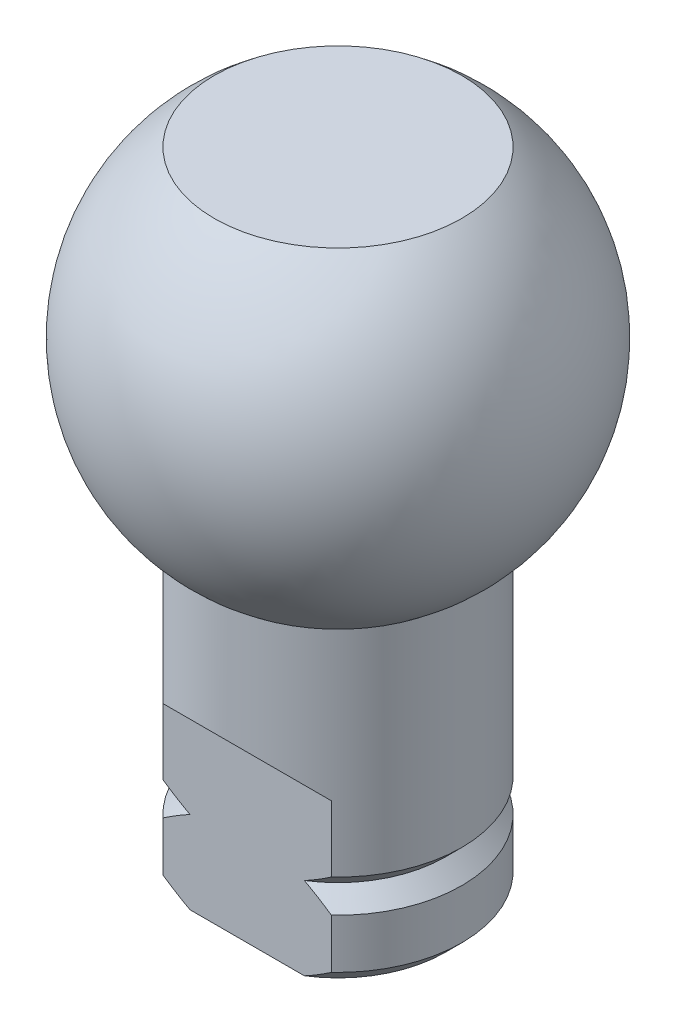
ISO-10303-21;
HEADER;
FILE_DESCRIPTION(('STEP AP214'),'2;1');
FILE_NAME('part.step','',(''),(''),'','','');
FILE_SCHEMA(('AUTOMOTIVE_DESIGN { 1 0 10303 214 1 1 1 1 }'));
ENDSEC;
DATA;
#1=APPLICATION_CONTEXT('core data for automotive mechanical design processes');
#2=APPLICATION_PROTOCOL_DEFINITION('international standard','automotive_design',2000,#1);
#3=PRODUCT_CONTEXT('',#1,'mechanical');
#4=PRODUCT('Part','Part','',(#3));
#5=PRODUCT_RELATED_PRODUCT_CATEGORY('part','',(#4));
#6=PRODUCT_DEFINITION_FORMATION('','',#4);
#7=PRODUCT_DEFINITION_CONTEXT('part definition',#1,'design');
#8=PRODUCT_DEFINITION('design','',#6,#7);
#9=PRODUCT_DEFINITION_SHAPE('','',#8);
#10=(LENGTH_UNIT() NAMED_UNIT(*) SI_UNIT(.MILLI.,.METRE.));
#11=(NAMED_UNIT(*) PLANE_ANGLE_UNIT() SI_UNIT($,.RADIAN.));
#12=(NAMED_UNIT(*) SI_UNIT($,.STERADIAN.) SOLID_ANGLE_UNIT());
#13=UNCERTAINTY_MEASURE_WITH_UNIT(LENGTH_MEASURE(1.E-05),#10,'distance_accuracy_value','');
#14=(GEOMETRIC_REPRESENTATION_CONTEXT(3) GLOBAL_UNCERTAINTY_ASSIGNED_CONTEXT((#13)) GLOBAL_UNIT_ASSIGNED_CONTEXT((#10,
#11,#12)) REPRESENTATION_CONTEXT('',''));
#15=CARTESIAN_POINT('',(0.,0.,0.));
#16=DIRECTION('',(0.,0.,1.));
#17=DIRECTION('',(1.,0.,0.));
#18=AXIS2_PLACEMENT_3D('',#15,#16,#17);
#19=CARTESIAN_POINT('',(0.,20.,0.));
#20=DIRECTION('',(0.,-1.,0.));
#21=DIRECTION('',(0.,0.,-1.));
#22=AXIS2_PLACEMENT_3D('',#19,#20,#21);
#23=CYLINDRICAL_SURFACE('',#22,7.5);
#24=DIRECTION('',(0.,-1.,0.));
#25=VECTOR('',#24,1.);
#26=CARTESIAN_POINT('',(5.09901951359278,12.,5.5));
#27=LINE('',#26,#25);
#28=CARTESIAN_POINT('',(5.09901951359278,4.,5.5));
#29=VERTEX_POINT('',#28);
#30=CARTESIAN_POINT('',(5.09901951359278,1.,5.5));
#31=VERTEX_POINT('',#30);
#32=EDGE_CURVE('E134',#29,#31,#27,.T.);
#33=ORIENTED_EDGE('',*,*,#32,.T.);
#34=CARTESIAN_POINT('',(0.,1.,0.));
#35=DIRECTION('',(0.,1.,0.));
#36=DIRECTION('',(0.,0.,1.));
#37=AXIS2_PLACEMENT_3D('',#34,#35,#36);
#38=CIRCLE('',#37,7.5);
#39=CARTESIAN_POINT('',(-5.09901951359278,1.,5.5));
#40=VERTEX_POINT('',#39);
#41=EDGE_CURVE('E188',#31,#40,#38,.T.);
#42=ORIENTED_EDGE('',*,*,#41,.T.);
#43=DIRECTION('',(0.,-1.,0.));
#44=VECTOR('',#43,1.);
#45=CARTESIAN_POINT('',(-5.09901951359278,12.,5.5));
#46=LINE('',#45,#44);
#47=CARTESIAN_POINT('',(-5.09901951359278,4.,5.5));
#48=VERTEX_POINT('',#47);
#49=EDGE_CURVE('E105',#48,#40,#46,.T.);
#50=ORIENTED_EDGE('',*,*,#49,.F.);
#51=CARTESIAN_POINT('',(0.,4.,0.));
#52=DIRECTION('',(0.,1.,0.));
#53=DIRECTION('',(0.,0.,1.));
#54=AXIS2_PLACEMENT_3D('',#51,#52,#53);
#55=CIRCLE('',#54,7.5);
#56=EDGE_CURVE('E123',#29,#48,#55,.T.);
#57=ORIENTED_EDGE('',*,*,#56,.F.);
#58=EDGE_LOOP('',(#33,#42,#50,#57));
#59=FACE_BOUND('',#58,.T.);
#60=ADVANCED_FACE('F38',(#59),#23,.T.);
#61=CARTESIAN_POINT('',(0.,12.,5.5));
#62=DIRECTION('',(0.,0.,1.));
#63=DIRECTION('',(1.,0.,0.));
#64=AXIS2_PLACEMENT_3D('',#61,#62,#63);
#65=PLANE('',#64);
#66=ORIENTED_EDGE('',*,*,#49,.T.);
#67=CARTESIAN_POINT('',(-5.09901951359278,1.,5.5));
#68=CARTESIAN_POINT('',(-4.9668431784928,0.910156478076386,5.5));
#69=CARTESIAN_POINT('',(-4.83380091391784,0.821565300297147,5.5));
#70=CARTESIAN_POINT('',(-4.56584190053604,0.647480457165828,5.5));
#71=CARTESIAN_POINT('',(-4.43092654924085,0.561984637870674,5.5));
#72=CARTESIAN_POINT('',(-4.15887044942243,0.394541164597885,5.5));
#73=CARTESIAN_POINT('',(-4.02172935527912,0.312594069066178,5.5));
#74=CARTESIAN_POINT('',(-3.74488250687396,0.152927084592284,5.5));
#75=CARTESIAN_POINT('',(-3.60517499749423,0.075210244402182,5.5));
#76=CARTESIAN_POINT('',(-3.46410161513774,0.,5.5));
#77=B_SPLINE_CURVE_WITH_KNOTS('',3,(#67,#68,#69,#70,#71,#72,#73,#74,#75,#76),.UNSPECIFIED.,.F.,
.F.,(4,2,2,2,4),(0.,0.47947014160503,0.958599961368361,1.4378049075597,1.91735076508269),.UNSPECIFIED.);
#78=CARTESIAN_POINT('',(-3.46410161513774,0.,5.5));
#79=VERTEX_POINT('',#78);
#80=EDGE_CURVE('E49',#40,#79,#77,.T.);
#81=ORIENTED_EDGE('',*,*,#80,.T.);
#82=DIRECTION('',(-1.,0.,0.));
#83=VECTOR('',#82,1.);
#84=CARTESIAN_POINT('',(0.,0.,5.5));
#85=LINE('',#84,#83);
#86=CARTESIAN_POINT('',(3.46410161513774,0.,5.5));
#87=VERTEX_POINT('',#86);
#88=EDGE_CURVE('E128',#87,#79,#85,.T.);
#89=ORIENTED_EDGE('',*,*,#88,.F.);
#90=CARTESIAN_POINT('',(3.46410161513774,0.,5.5));
#91=CARTESIAN_POINT('',(3.60517499749423,0.0752102444021818,5.5));
#92=CARTESIAN_POINT('',(3.74488250687396,0.152927084592284,5.5));
#93=CARTESIAN_POINT('',(4.02172935527912,0.312594069066178,5.5));
#94=CARTESIAN_POINT('',(4.15887044942243,0.394541164597885,5.5));
#95=CARTESIAN_POINT('',(4.43092654924085,0.561984637870675,5.5));
#96=CARTESIAN_POINT('',(4.56584190053604,0.647480457165828,5.5));
#97=CARTESIAN_POINT('',(4.83380091391784,0.821565300297147,5.5));
#98=CARTESIAN_POINT('',(4.9668431784928,0.910156478076387,5.5));
#99=CARTESIAN_POINT('',(5.09901951359278,1.,5.5));
#100=B_SPLINE_CURVE_WITH_KNOTS('',3,(#90,#91,#92,#93,#94,#95,#96,#97,#98,#99),.UNSPECIFIED.,.F.,
.F.,(4,2,2,2,4),(0.,0.479545857522985,0.958750803714324,1.43788062347766,1.91735076508269),.UNSPECIFIED.);
#101=EDGE_CURVE('E181',#87,#31,#100,.T.);
#102=ORIENTED_EDGE('',*,*,#101,.T.);
#103=ORIENTED_EDGE('',*,*,#32,.F.);
#104=CARTESIAN_POINT('',(5.09901951359277,4.,5.5));
#105=CARTESIAN_POINT('',(4.9668431784928,4.08984352192361,5.5));
#106=CARTESIAN_POINT('',(4.83380091391783,4.17843469970285,5.5));
#107=CARTESIAN_POINT('',(4.56584190053604,4.35251954283417,5.5));
#108=CARTESIAN_POINT('',(4.43092654924085,4.43801536212933,5.5));
#109=CARTESIAN_POINT('',(4.15887044942244,4.60545883540212,5.5));
#110=CARTESIAN_POINT('',(4.02172935527913,4.68740593093383,5.5));
#111=CARTESIAN_POINT('',(3.74488250687397,4.84707291540772,5.5));
#112=CARTESIAN_POINT('',(3.60517499749425,4.92478975559783,5.5));
#113=CARTESIAN_POINT('',(3.46410161513776,5.00000000000001,5.5));
#114=B_SPLINE_CURVE_WITH_KNOTS('',3,(#104,#105,#106,#107,#108,#109,#110,#111,#112,#113),
.UNSPECIFIED.,.F.,.F.,(4,2,2,2,4),(0.,0.479470141605026,0.958599961368353,1.43780490755969,
1.91735076508267),.UNSPECIFIED.);
#115=CARTESIAN_POINT('',(3.46410161513776,4.99999999999999,5.5));
#116=VERTEX_POINT('',#115);
#117=EDGE_CURVE('E175',#29,#116,#114,.T.);
#118=ORIENTED_EDGE('',*,*,#117,.T.);
#119=CARTESIAN_POINT('',(3.46410161513776,4.99999999999999,5.5));
#120=CARTESIAN_POINT('',(3.60517499749425,5.07521024440218,5.5));
#121=CARTESIAN_POINT('',(3.74488250687397,5.15292708459228,5.5));
#122=CARTESIAN_POINT('',(4.02172935527913,5.31259406906617,5.5));
#123=CARTESIAN_POINT('',(4.15887044942243,5.39454116459788,5.5));
#124=CARTESIAN_POINT('',(4.43092654924084,5.56198463787067,5.5));
#125=CARTESIAN_POINT('',(4.56584190053604,5.64748045716583,5.5));
#126=CARTESIAN_POINT('',(4.83380091391783,5.82156530029715,5.5));
#127=CARTESIAN_POINT('',(4.96684317849279,5.91015647807639,5.5));
#128=CARTESIAN_POINT('',(5.09901951359277,6.,5.5));
#129=B_SPLINE_CURVE_WITH_KNOTS('',3,(#119,#120,#121,#122,#123,#124,#125,#126,#127,#128),
.UNSPECIFIED.,.F.,.F.,(4,2,2,2,4),(0.,0.479545857522979,0.958750803714316,1.43788062347764,
1.91735076508267),.UNSPECIFIED.);
#130=CARTESIAN_POINT('',(5.09901951359278,6.,5.5));
#131=VERTEX_POINT('',#130);
#132=EDGE_CURVE('E117',#116,#131,#129,.T.);
#133=ORIENTED_EDGE('',*,*,#132,.T.);
#134=CARTESIAN_POINT('',(5.09901951359278,9.99999999999998,5.5));
#135=VERTEX_POINT('',#134);
#136=EDGE_CURVE('E120',#135,#131,#27,.T.);
#137=ORIENTED_EDGE('',*,*,#136,.F.);
#138=DIRECTION('',(-1.,0.,0.));
#139=VECTOR('',#138,1.);
#140=CARTESIAN_POINT('',(-5.09901951359278,9.99999999999998,5.5));
#141=LINE('',#140,#139);
#142=CARTESIAN_POINT('',(-5.09901951359278,9.99999999999998,5.5));
#143=VERTEX_POINT('',#142);
#144=EDGE_CURVE('E100',#135,#143,#141,.T.);
#145=ORIENTED_EDGE('',*,*,#144,.T.);
#146=CARTESIAN_POINT('',(-5.09901951359278,6.,5.5));
#147=VERTEX_POINT('',#146);
#148=EDGE_CURVE('E93',#143,#147,#46,.T.);
#149=ORIENTED_EDGE('',*,*,#148,.T.);
#150=CARTESIAN_POINT('',(-5.09901951359277,6.,5.5));
#151=CARTESIAN_POINT('',(-4.9668431784928,5.91015647807639,5.5));
#152=CARTESIAN_POINT('',(-4.83380091391783,5.82156530029715,5.5));
#153=CARTESIAN_POINT('',(-4.56584190053604,5.64748045716583,5.5));
#154=CARTESIAN_POINT('',(-4.43092654924085,5.56198463787067,5.5));
#155=CARTESIAN_POINT('',(-4.15887044942243,5.39454116459788,5.5));
#156=CARTESIAN_POINT('',(-4.02172935527913,5.31259406906617,5.5));
#157=CARTESIAN_POINT('',(-3.74488250687397,5.15292708459228,5.5));
#158=CARTESIAN_POINT('',(-3.60517499749425,5.07521024440218,5.5));
#159=CARTESIAN_POINT('',(-3.46410161513776,4.99999999999999,5.5));
#160=B_SPLINE_CURVE_WITH_KNOTS('',3,(#150,#151,#152,#153,#154,#155,#156,#157,#158,#159),
.UNSPECIFIED.,.F.,.F.,(4,2,2,2,4),(0.,0.479470141605026,0.958599961368353,1.43780490755969,
1.91735076508267),.UNSPECIFIED.);
#161=CARTESIAN_POINT('',(-3.46410161513776,4.99999999999999,5.5));
#162=VERTEX_POINT('',#161);
#163=EDGE_CURVE('E96',#147,#162,#160,.T.);
#164=ORIENTED_EDGE('',*,*,#163,.T.);
#165=CARTESIAN_POINT('',(-3.46410161513776,5.00000000000001,5.5));
#166=CARTESIAN_POINT('',(-3.60517499749425,4.92478975559783,5.5));
#167=CARTESIAN_POINT('',(-3.74488250687397,4.84707291540772,5.5));
#168=CARTESIAN_POINT('',(-4.02172935527913,4.68740593093383,5.5));
#169=CARTESIAN_POINT('',(-4.15887044942243,4.60545883540212,5.5));
#170=CARTESIAN_POINT('',(-4.43092654924085,4.43801536212933,5.5));
#171=CARTESIAN_POINT('',(-4.56584190053604,4.35251954283417,5.5));
#172=CARTESIAN_POINT('',(-4.83380091391783,4.17843469970285,5.5));
#173=CARTESIAN_POINT('',(-4.9668431784928,4.08984352192361,5.5));
#174=CARTESIAN_POINT('',(-5.09901951359277,4.,5.5));
#175=B_SPLINE_CURVE_WITH_KNOTS('',3,(#165,#166,#167,#168,#169,#170,#171,#172,#173,#174),
.UNSPECIFIED.,.F.,.F.,(4,2,2,2,4),(0.,0.479545857522979,0.958750803714316,1.43788062347764,
1.91735076508267),.UNSPECIFIED.);
#176=EDGE_CURVE('E116',#162,#48,#175,.T.);
#177=ORIENTED_EDGE('',*,*,#176,.T.);
#178=EDGE_LOOP('',(#66,#81,#89,#102,#103,#118,#133,#137,#145,#149,#164,#177));
#179=FACE_BOUND('',#178,.T.);
#180=ADVANCED_FACE('F95',(#179),#65,.T.);
#181=CARTESIAN_POINT('',(0.,19.,0.));
#182=DIRECTION('',(0.,-1.,0.));
#183=DIRECTION('',(1.,0.,0.));
#184=AXIS2_PLACEMENT_3D('',#181,#182,#183);
#185=CIRCLE('',#184,7.5);
#186=CARTESIAN_POINT('',(7.5,19.,0.));
#187=VERTEX_POINT('',#186);
#188=EDGE_CURVE('E104',#187,#187,#185,.T.);
#189=ORIENTED_EDGE('',*,*,#188,.T.);
#190=EDGE_LOOP('',(#189));
#191=FACE_BOUND('',#190,.T.);
#192=CARTESIAN_POINT('',(0.,4.49999999999991,0.));
#193=DIRECTION('',(0.,-0.707106781186543,0.707106781186552));
#194=DIRECTION('',(0.,-0.707106781186552,-0.707106781186543));
#195=AXIS2_PLACEMENT_3D('',#192,#193,#194);
#196=ELLIPSE('',#195,10.6066017177983,7.5);
#197=CARTESIAN_POINT('',(0.,12.,7.49999999999999));
#198=VERTEX_POINT('',#197);
#199=EDGE_CURVE('E199',#143,#198,#196,.F.);
#200=ORIENTED_EDGE('',*,*,#199,.T.);
#201=CARTESIAN_POINT('',(0.,4.49999999999991,0.));
#202=DIRECTION('',(0.,-0.707106781186543,0.707106781186552));
#203=DIRECTION('',(0.,-0.707106781186552,-0.707106781186543));
#204=AXIS2_PLACEMENT_3D('',#201,#202,#203);
#205=ELLIPSE('',#204,10.6066017177983,7.5);
#206=EDGE_CURVE('E213',#198,#135,#205,.F.);
#207=ORIENTED_EDGE('',*,*,#206,.T.);
#208=ORIENTED_EDGE('',*,*,#136,.T.);
#209=CARTESIAN_POINT('',(0.,6.,0.));
#210=DIRECTION('',(0.,1.,0.));
#211=DIRECTION('',(0.,0.,1.));
#212=AXIS2_PLACEMENT_3D('',#209,#210,#211);
#213=CIRCLE('',#212,7.5);
#214=EDGE_CURVE('E112',#131,#147,#213,.T.);
#215=ORIENTED_EDGE('',*,*,#214,.T.);
#216=ORIENTED_EDGE('',*,*,#148,.F.);
#217=EDGE_LOOP('',(#200,#207,#208,#215,#216));
#218=FACE_BOUND('',#217,.T.);
#219=ADVANCED_FACE('F119',(#191,#218),#23,.T.);
#220=CARTESIAN_POINT('',(0.,0.,0.));
#221=DIRECTION('',(0.,1.,0.));
#222=DIRECTION('',(0.,0.,1.));
#223=AXIS2_PLACEMENT_3D('',#220,#221,#222);
#224=PLANE('',#223);
#225=ORIENTED_EDGE('',*,*,#88,.T.);
#226=CARTESIAN_POINT('',(0.,0.,0.));
#227=DIRECTION('',(0.,1.,0.));
#228=DIRECTION('',(0.,0.,1.));
#229=AXIS2_PLACEMENT_3D('',#226,#227,#228);
#230=CIRCLE('',#229,6.49999999999999);
#231=EDGE_CURVE('E11',#79,#87,#230,.F.);
#232=ORIENTED_EDGE('',*,*,#231,.T.);
#233=EDGE_LOOP('',(#225,#232));
#234=FACE_BOUND('',#233,.T.);
#235=ADVANCED_FACE('F232',(#234),#224,.F.);
#236=CARTESIAN_POINT('',(0.,39.,0.));
#237=DIRECTION('',(0.,1.,0.));
#238=DIRECTION('',(-1.,0.,0.));
#239=AXIS2_PLACEMENT_3D('',#236,#237,#238);
#240=PLANE('',#239);
#241=CARTESIAN_POINT('',(0.,39.,0.));
#242=DIRECTION('',(0.,-1.,0.));
#243=DIRECTION('',(1.,0.,0.));
#244=AXIS2_PLACEMENT_3D('',#241,#242,#243);
#245=CIRCLE('',#244,7.50000000000001);
#246=CARTESIAN_POINT('',(7.50000000000002,39.,0.));
#247=VERTEX_POINT('',#246);
#248=EDGE_CURVE('E140',#247,#247,#245,.T.);
#249=ORIENTED_EDGE('',*,*,#248,.F.);
#250=EDGE_LOOP('',(#249));
#251=FACE_BOUND('',#250,.T.);
#252=ADVANCED_FACE('F237',(#251),#240,.T.);
#253=CARTESIAN_POINT('',(0.,29.,0.));
#254=DIRECTION('',(0.,-1.,0.));
#255=DIRECTION('',(1.,0.,0.));
#256=AXIS2_PLACEMENT_3D('',#253,#254,#255);
#257=SPHERICAL_SURFACE('',#256,12.5);
#258=CARTESIAN_POINT('',(7.50000000000002,39.,0.));
#259=CARTESIAN_POINT('',(7.69319193878752,38.8551165792664,0.));
#260=CARTESIAN_POINT('',(7.88217465213851,38.7046222693532,0.));
#261=CARTESIAN_POINT('',(8.25111094520632,38.392945529571,0.));
#262=CARTESIAN_POINT('',(8.43106452492312,38.2317630997021,0.));
#263=CARTESIAN_POINT('',(8.78133186796137,37.899243778412,0.));
#264=CARTESIAN_POINT('',(8.9516456312828,37.7279068869908,0.));
#265=CARTESIAN_POINT('',(9.28206315287027,37.3756560159455,0.));
#266=CARTESIAN_POINT('',(9.4421669111363,37.1947420363212,0.));
#267=CARTESIAN_POINT('',(9.7516263418269,36.8239439448229,0.));
#268=CARTESIAN_POINT('',(9.90098201425148,36.6340598329489,0.));
#269=CARTESIAN_POINT('',(10.1884438673127,36.2459592446309,0.));
#270=CARTESIAN_POINT('',(10.3265500479494,36.0477427681871,0.));
#271=CARTESIAN_POINT('',(10.5910491304544,35.6436430130857,0.));
#272=CARTESIAN_POINT('',(10.7174420323227,35.4377597344282,0.));
#273=CARTESIAN_POINT('',(10.9580901448183,35.0190177315831,0.));
#274=CARTESIAN_POINT('',(11.0723453554456,34.8061590073955,0.));
#275=CARTESIAN_POINT('',(11.2883344195524,34.3741808801035,0.));
#276=CARTESIAN_POINT('',(11.3900682730319,34.1550614769992,0.));
#277=CARTESIAN_POINT('',(11.5806730060618,33.7112977851068,0.));
#278=CARTESIAN_POINT('',(11.6695438856122,33.4866534963188,0.));
#279=CARTESIAN_POINT('',(11.8341242464484,33.0325943776405,0.));
#280=CARTESIAN_POINT('',(11.9098337277343,32.8031795477502,0.));
#281=CARTESIAN_POINT('',(12.0478370632681,32.3403497109532,0.));
#282=CARTESIAN_POINT('',(12.1101309175161,32.1069347040466,0.));
#283=CARTESIAN_POINT('',(12.2210938191772,31.6368883096374,0.));
#284=CARTESIAN_POINT('',(12.2697628665904,31.400256922135,0.));
#285=CARTESIAN_POINT('',(12.3533127262505,30.9245723634256,0.));
#286=CARTESIAN_POINT('',(12.3881935384975,30.6855191922186,0.));
#287=CARTESIAN_POINT('',(12.4440497997244,30.2057937952205,0.));
#288=CARTESIAN_POINT('',(12.4650252487042,29.9651215694293,0.));
#289=CARTESIAN_POINT('',(12.493000348842,29.482966229092,0.));
#290=CARTESIAN_POINT('',(12.5,29.241483114546,0.));
#291=CARTESIAN_POINT('',(12.5,28.758516885454,0.));
#292=CARTESIAN_POINT('',(12.493000348842,28.5170337709079,0.));
#293=CARTESIAN_POINT('',(12.4650252487042,28.0348784305707,0.));
#294=CARTESIAN_POINT('',(12.4440497997244,27.7942062047795,0.));
#295=CARTESIAN_POINT('',(12.3881935384975,27.3144808077813,0.));
#296=CARTESIAN_POINT('',(12.3533127262505,27.0754276365744,0.));
#297=CARTESIAN_POINT('',(12.2697628665904,26.599743077865,0.));
#298=CARTESIAN_POINT('',(12.2210938191772,26.3631116903625,0.));
#299=CARTESIAN_POINT('',(12.1101309175161,25.8930652959534,0.));
#300=CARTESIAN_POINT('',(12.0478370632681,25.6596502890467,0.));
#301=CARTESIAN_POINT('',(11.9098337277343,25.1968204522498,0.));
#302=CARTESIAN_POINT('',(11.8341242464484,24.9674056223595,0.));
#303=CARTESIAN_POINT('',(11.6695438856122,24.5133465036812,0.));
#304=CARTESIAN_POINT('',(11.5806730060618,24.2887022148932,0.));
#305=CARTESIAN_POINT('',(11.3900682730319,23.8449385230008,0.));
#306=CARTESIAN_POINT('',(11.2883344195523,23.6258191198965,0.));
#307=CARTESIAN_POINT('',(11.0723453554456,23.1938409926045,0.));
#308=CARTESIAN_POINT('',(10.9580901448183,22.9809822684169,0.));
#309=CARTESIAN_POINT('',(10.7174420323227,22.5622402655718,0.));
#310=CARTESIAN_POINT('',(10.5910491304544,22.3563569869142,0.));
#311=CARTESIAN_POINT('',(10.3265500479494,21.9522572318129,0.));
#312=CARTESIAN_POINT('',(10.1884438673127,21.754040755369,0.));
#313=CARTESIAN_POINT('',(9.90098201425146,21.3659401670511,0.));
#314=CARTESIAN_POINT('',(9.75162634182689,21.1760560551771,0.));
#315=CARTESIAN_POINT('',(9.44216691113628,20.8052579636787,0.));
#316=CARTESIAN_POINT('',(9.28206315287025,20.6243439840545,0.));
#317=CARTESIAN_POINT('',(8.95164563128279,20.2720931130091,0.));
#318=CARTESIAN_POINT('',(8.78133186796135,20.100756221588,0.));
#319=CARTESIAN_POINT('',(8.43106452492311,19.7682369002979,0.));
#320=CARTESIAN_POINT('',(8.2511109452063,19.607054470429,0.));
#321=CARTESIAN_POINT('',(7.8821746521385,19.2953777306468,0.));
#322=CARTESIAN_POINT('',(7.6931919387875,19.1448834207336,0.));
#323=CARTESIAN_POINT('',(7.5,19.,0.));
#324=B_SPLINE_CURVE_WITH_KNOTS('',3,(#258,#259,#260,#261,#262,#263,#264,#265,#266,#267,#268,
#269,#270,#271,#272,#273,#274,#275,#276,#277,#278,#279,#280,#281,#282,#283,#284,#285,#286,#287,
#288,#289,#290,#291,#292,#293,#294,#295,#296,#297,#298,#299,#300,#301,#302,#303,#304,#305,#306,
#307,#308,#309,#310,#311,#312,#313,#314,#315,#316,#317,#318,#319,#320,#321,#322,#323),
.UNSPECIFIED.,.F.,.F.,(4,2,2,2,2,2,2,2,2,2,2,2,2,2,2,2,2,2,2,2,2,2,2,2,2,2,2,2,2,2,2,2,4),(0.,
0.724348003843397,1.4486960076868,2.17304401153019,2.89739201537359,3.62174001921699,
4.34608802306039,5.07043602690379,5.79478403074719,6.51913203459059,7.24348003843398,
7.96782804227738,8.69217604612079,9.41652404996418,10.1408720538076,10.865220057651,
11.5895680614944,12.3139160653378,13.0382640691812,13.7626120730246,14.486960076868,
15.2113080807114,15.9356560845548,16.6600040883982,17.3843520922416,18.108700096085,
18.8330480999284,19.5573961037718,20.2817441076152,21.0060921114586,21.730440115302,
22.4547881191454,23.1791361229888),.UNSPECIFIED.);
#325=EDGE_CURVE('BSEAM163',#247,#187,#324,.T.);
#326=ORIENTED_EDGE('',*,*,#248,.T.);
#327=ORIENTED_EDGE('',*,*,#188,.F.);
#328=ORIENTED_EDGE('',*,*,#325,.T.);
#329=ORIENTED_EDGE('',*,*,#325,.F.);
#330=EDGE_LOOP('',(#326,#328,#327,#329));
#331=FACE_BOUND('',#330,.T.);
#332=ADVANCED_FACE('F163',(#331),#257,.T.);
#333=CARTESIAN_POINT('',(0.,5.00000000000001,0.));
#334=DIRECTION('',(0.,-1.,0.));
#335=DIRECTION('',(0.,0.,-1.));
#336=AXIS2_PLACEMENT_3D('',#333,#334,#335);
#337=CONICAL_SURFACE('',#336,6.5,0.78539816339744);
#338=ORIENTED_EDGE('',*,*,#56,.T.);
#339=ORIENTED_EDGE('',*,*,#176,.F.);
#340=CARTESIAN_POINT('',(0.,5.00000000000001,0.));
#341=DIRECTION('',(0.,1.,0.));
#342=DIRECTION('',(0.,0.,1.));
#343=AXIS2_PLACEMENT_3D('',#340,#341,#342);
#344=CIRCLE('',#343,6.5);
#345=EDGE_CURVE('E114',#116,#162,#344,.T.);
#346=ORIENTED_EDGE('',*,*,#345,.F.);
#347=ORIENTED_EDGE('',*,*,#117,.F.);
#348=EDGE_LOOP('',(#338,#339,#346,#347));
#349=FACE_BOUND('',#348,.T.);
#350=ADVANCED_FACE('F209',(#349),#337,.T.);
#351=CARTESIAN_POINT('',(0.,4.99999999999999,0.));
#352=DIRECTION('',(0.,1.,0.));
#353=DIRECTION('',(0.,0.,1.));
#354=AXIS2_PLACEMENT_3D('',#351,#352,#353);
#355=CONICAL_SURFACE('',#354,6.5,0.78539816339744);
#356=ORIENTED_EDGE('',*,*,#163,.F.);
#357=ORIENTED_EDGE('',*,*,#214,.F.);
#358=ORIENTED_EDGE('',*,*,#132,.F.);
#359=ORIENTED_EDGE('',*,*,#345,.T.);
#360=EDGE_LOOP('',(#356,#357,#358,#359));
#361=FACE_BOUND('',#360,.T.);
#362=ADVANCED_FACE('F110',(#361),#355,.T.);
#363=CARTESIAN_POINT('',(0.,9.99999999999998,5.5));
#364=DIRECTION('',(0.,-0.707106781186543,0.707106781186552));
#365=DIRECTION('',(1.,0.,0.));
#366=AXIS2_PLACEMENT_3D('',#363,#364,#365);
#367=PLANE('',#366);
#368=ORIENTED_EDGE('',*,*,#144,.F.);
#369=ORIENTED_EDGE('',*,*,#206,.F.);
#370=ORIENTED_EDGE('',*,*,#199,.F.);
#371=EDGE_LOOP('',(#368,#369,#370));
#372=FACE_BOUND('',#371,.T.);
#373=ADVANCED_FACE('F219',(#372),#367,.T.);
#374=CARTESIAN_POINT('',(0.,1.,0.));
#375=DIRECTION('',(0.,1.,0.));
#376=DIRECTION('',(0.,0.,1.));
#377=AXIS2_PLACEMENT_3D('',#374,#375,#376);
#378=CONICAL_SURFACE('',#377,7.5,0.785398163397451);
#379=ORIENTED_EDGE('',*,*,#101,.F.);
#380=ORIENTED_EDGE('',*,*,#231,.F.);
#381=ORIENTED_EDGE('',*,*,#80,.F.);
#382=ORIENTED_EDGE('',*,*,#41,.F.);
#383=EDGE_LOOP('',(#379,#380,#381,#382));
#384=FACE_BOUND('',#383,.T.);
#385=ADVANCED_FACE('F41',(#384),#378,.T.);
#386=CLOSED_SHELL('',(#60,#180,#219,#235,#252,#332,#350,#362,#373,#385));
#387=MANIFOLD_SOLID_BREP('B2',#386);
#388=ADVANCED_BREP_SHAPE_REPRESENTATION('',(#18,#387),#14);
#389=SHAPE_DEFINITION_REPRESENTATION(#9,#388);
ENDSEC;
END-ISO-10303-21;
